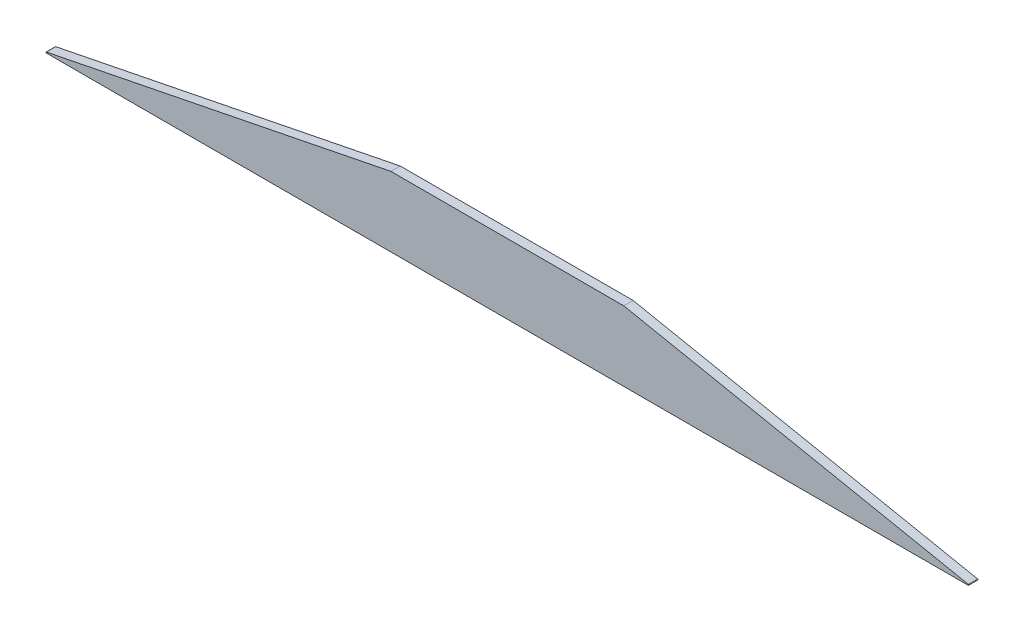
ISO-10303-21;
HEADER;
FILE_DESCRIPTION(('STEP AP214'),'2;1');
FILE_NAME('part.step','',(''),(''),'','','');
FILE_SCHEMA(('AUTOMOTIVE_DESIGN { 1 0 10303 214 1 1 1 1 }'));
ENDSEC;
DATA;
#1=APPLICATION_CONTEXT('core data for automotive mechanical design processes');
#2=APPLICATION_PROTOCOL_DEFINITION('international standard','automotive_design',2000,#1);
#3=PRODUCT_CONTEXT('',#1,'mechanical');
#4=PRODUCT('Part','Part','',(#3));
#5=PRODUCT_RELATED_PRODUCT_CATEGORY('part','',(#4));
#6=PRODUCT_DEFINITION_FORMATION('','',#4);
#7=PRODUCT_DEFINITION_CONTEXT('part definition',#1,'design');
#8=PRODUCT_DEFINITION('design','',#6,#7);
#9=PRODUCT_DEFINITION_SHAPE('','',#8);
#10=(LENGTH_UNIT() NAMED_UNIT(*) SI_UNIT(.MILLI.,.METRE.));
#11=(NAMED_UNIT(*) PLANE_ANGLE_UNIT() SI_UNIT($,.RADIAN.));
#12=(NAMED_UNIT(*) SI_UNIT($,.STERADIAN.) SOLID_ANGLE_UNIT());
#13=UNCERTAINTY_MEASURE_WITH_UNIT(LENGTH_MEASURE(1.E-05),#10,'distance_accuracy_value','');
#14=(GEOMETRIC_REPRESENTATION_CONTEXT(3) GLOBAL_UNCERTAINTY_ASSIGNED_CONTEXT((#13)) GLOBAL_UNIT_ASSIGNED_CONTEXT((#10,
#11,#12)) REPRESENTATION_CONTEXT('',''));
#15=CARTESIAN_POINT('',(0.,0.,0.));
#16=DIRECTION('',(0.,0.,1.));
#17=DIRECTION('',(1.,0.,0.));
#18=AXIS2_PLACEMENT_3D('',#15,#16,#17);
#19=CARTESIAN_POINT('',(-125.,75.,10.));
#20=DIRECTION('',(0.196116135138184,-0.98058067569092,0.));
#21=DIRECTION('',(0.98058067569092,0.196116135138184,0.));
#22=AXIS2_PLACEMENT_3D('',#19,#20,#21);
#23=PLANE('',#22);
#24=DIRECTION('',(-0.98058067569092,-0.196116135138184,0.));
#25=VECTOR('',#24,1.);
#26=CARTESIAN_POINT('',(-125.,75.,0.));
#27=LINE('',#26,#25);
#28=CARTESIAN_POINT('',(-125.,75.,0.));
#29=VERTEX_POINT('',#28);
#30=CARTESIAN_POINT('',(-495.048548310773,0.990290337845479,0.));
#31=VERTEX_POINT('',#30);
#32=EDGE_CURVE('E121',#29,#31,#27,.T.);
#33=ORIENTED_EDGE('',*,*,#32,.T.);
#34=DIRECTION('',(0.,0.,-1.));
#35=VECTOR('',#34,1.);
#36=CARTESIAN_POINT('',(-495.048548310773,0.990290337845479,10.));
#37=LINE('',#36,#35);
#38=CARTESIAN_POINT('',(-495.048548310773,0.990290337845479,10.));
#39=VERTEX_POINT('',#38);
#40=EDGE_CURVE('E11',#31,#39,#37,.F.);
#41=ORIENTED_EDGE('',*,*,#40,.T.);
#42=DIRECTION('',(-0.98058067569092,-0.196116135138184,0.));
#43=VECTOR('',#42,1.);
#44=CARTESIAN_POINT('',(-125.,75.,10.));
#45=LINE('',#44,#43);
#46=CARTESIAN_POINT('',(-125.,75.,10.));
#47=VERTEX_POINT('',#46);
#48=EDGE_CURVE('E127',#47,#39,#45,.T.);
#49=ORIENTED_EDGE('',*,*,#48,.F.);
#50=DIRECTION('',(0.,0.,-1.));
#51=VECTOR('',#50,1.);
#52=CARTESIAN_POINT('',(-125.,75.,10.));
#53=LINE('',#52,#51);
#54=EDGE_CURVE('E113',#47,#29,#53,.T.);
#55=ORIENTED_EDGE('',*,*,#54,.T.);
#56=EDGE_LOOP('',(#33,#41,#49,#55));
#57=FACE_BOUND('',#56,.T.);
#58=ADVANCED_FACE('F39',(#57),#23,.F.);
#59=CARTESIAN_POINT('',(-500.,0.,10.));
#60=DIRECTION('',(0.,1.,0.));
#61=DIRECTION('',(0.,0.,1.));
#62=AXIS2_PLACEMENT_3D('',#59,#60,#61);
#63=PLANE('',#62);
#64=DIRECTION('',(1.,0.,0.));
#65=VECTOR('',#64,1.);
#66=CARTESIAN_POINT('',(-500.,0.,0.));
#67=LINE('',#66,#65);
#68=CARTESIAN_POINT('',(-494.950490243204,0.,0.));
#69=VERTEX_POINT('',#68);
#70=CARTESIAN_POINT('',(494.950490243204,0.,0.));
#71=VERTEX_POINT('',#70);
#72=EDGE_CURVE('E123',#69,#71,#67,.T.);
#73=ORIENTED_EDGE('',*,*,#72,.T.);
#74=DIRECTION('',(0.,0.,-1.));
#75=VECTOR('',#74,1.);
#76=CARTESIAN_POINT('',(494.950490243204,0.,10.));
#77=LINE('',#76,#75);
#78=CARTESIAN_POINT('',(494.950490243204,0.,10.));
#79=VERTEX_POINT('',#78);
#80=EDGE_CURVE('E60',#71,#79,#77,.F.);
#81=ORIENTED_EDGE('',*,*,#80,.T.);
#82=DIRECTION('',(1.,0.,0.));
#83=VECTOR('',#82,1.);
#84=CARTESIAN_POINT('',(-500.,0.,10.));
#85=LINE('',#84,#83);
#86=CARTESIAN_POINT('',(-494.950490243204,0.,10.));
#87=VERTEX_POINT('',#86);
#88=EDGE_CURVE('E103',#87,#79,#85,.T.);
#89=ORIENTED_EDGE('',*,*,#88,.F.);
#90=DIRECTION('',(0.,0.,-1.));
#91=VECTOR('',#90,1.);
#92=CARTESIAN_POINT('',(-494.950490243204,0.,10.));
#93=LINE('',#92,#91);
#94=EDGE_CURVE('E134',#87,#69,#93,.T.);
#95=ORIENTED_EDGE('',*,*,#94,.T.);
#96=EDGE_LOOP('',(#73,#81,#89,#95));
#97=FACE_BOUND('',#96,.T.);
#98=ADVANCED_FACE('F142',(#97),#63,.F.);
#99=CARTESIAN_POINT('',(500.,0.,10.));
#100=DIRECTION('',(-0.196116135138184,-0.98058067569092,0.));
#101=DIRECTION('',(0.98058067569092,-0.196116135138184,0.));
#102=AXIS2_PLACEMENT_3D('',#99,#100,#101);
#103=PLANE('',#102);
#104=DIRECTION('',(-0.98058067569092,0.196116135138184,0.));
#105=VECTOR('',#104,1.);
#106=CARTESIAN_POINT('',(500.,0.,10.));
#107=LINE('',#106,#105);
#108=CARTESIAN_POINT('',(495.048548310773,0.990290337845456,10.));
#109=VERTEX_POINT('',#108);
#110=CARTESIAN_POINT('',(125.,75.,10.));
#111=VERTEX_POINT('',#110);
#112=EDGE_CURVE('E93',#109,#111,#107,.T.);
#113=ORIENTED_EDGE('',*,*,#112,.F.);
#114=DIRECTION('',(0.,0.,-1.));
#115=VECTOR('',#114,1.);
#116=CARTESIAN_POINT('',(495.048548310773,0.990290337845456,10.));
#117=LINE('',#116,#115);
#118=CARTESIAN_POINT('',(495.048548310773,0.990290337845456,0.));
#119=VERTEX_POINT('',#118);
#120=EDGE_CURVE('E112',#109,#119,#117,.T.);
#121=ORIENTED_EDGE('',*,*,#120,.T.);
#122=DIRECTION('',(-0.98058067569092,0.196116135138184,0.));
#123=VECTOR('',#122,1.);
#124=CARTESIAN_POINT('',(500.,0.,0.));
#125=LINE('',#124,#123);
#126=CARTESIAN_POINT('',(125.,75.,0.));
#127=VERTEX_POINT('',#126);
#128=EDGE_CURVE('E109',#119,#127,#125,.T.);
#129=ORIENTED_EDGE('',*,*,#128,.T.);
#130=DIRECTION('',(0.,0.,-1.));
#131=VECTOR('',#130,1.);
#132=CARTESIAN_POINT('',(125.,75.,10.));
#133=LINE('',#132,#131);
#134=EDGE_CURVE('E106',#111,#127,#133,.T.);
#135=ORIENTED_EDGE('',*,*,#134,.F.);
#136=EDGE_LOOP('',(#113,#121,#129,#135));
#137=FACE_BOUND('',#136,.T.);
#138=ADVANCED_FACE('F107',(#137),#103,.F.);
#139=CARTESIAN_POINT('',(125.,75.,10.));
#140=DIRECTION('',(0.,-1.,0.));
#141=DIRECTION('',(0.,0.,-1.));
#142=AXIS2_PLACEMENT_3D('',#139,#140,#141);
#143=PLANE('',#142);
#144=DIRECTION('',(-1.,0.,0.));
#145=VECTOR('',#144,1.);
#146=CARTESIAN_POINT('',(125.,75.,0.));
#147=LINE('',#146,#145);
#148=EDGE_CURVE('E126',#127,#29,#147,.T.);
#149=ORIENTED_EDGE('',*,*,#148,.T.);
#150=ORIENTED_EDGE('',*,*,#54,.F.);
#151=DIRECTION('',(-1.,0.,0.));
#152=VECTOR('',#151,1.);
#153=CARTESIAN_POINT('',(125.,75.,10.));
#154=LINE('',#153,#152);
#155=EDGE_CURVE('E97',#111,#47,#154,.T.);
#156=ORIENTED_EDGE('',*,*,#155,.F.);
#157=ORIENTED_EDGE('',*,*,#134,.T.);
#158=EDGE_LOOP('',(#149,#150,#156,#157));
#159=FACE_BOUND('',#158,.T.);
#160=ADVANCED_FACE('F115',(#159),#143,.F.);
#161=CARTESIAN_POINT('',(0.,0.,10.));
#162=DIRECTION('',(0.,0.,-1.));
#163=DIRECTION('',(-1.,0.,0.));
#164=AXIS2_PLACEMENT_3D('',#161,#162,#163);
#165=PLANE('',#164);
#166=ORIENTED_EDGE('',*,*,#88,.T.);
#167=CARTESIAN_POINT('',(494.950490243204,0.5,10.));
#168=DIRECTION('',(0.,0.,-1.));
#169=DIRECTION('',(-1.,0.,0.));
#170=AXIS2_PLACEMENT_3D('',#167,#168,#169);
#171=CIRCLE('',#170,0.5);
#172=EDGE_CURVE('E47',#79,#109,#171,.F.);
#173=ORIENTED_EDGE('',*,*,#172,.T.);
#174=ORIENTED_EDGE('',*,*,#112,.T.);
#175=ORIENTED_EDGE('',*,*,#155,.T.);
#176=ORIENTED_EDGE('',*,*,#48,.T.);
#177=CARTESIAN_POINT('',(-494.950490243204,0.5,10.));
#178=DIRECTION('',(0.,0.,-1.));
#179=DIRECTION('',(-1.,0.,0.));
#180=AXIS2_PLACEMENT_3D('',#177,#178,#179);
#181=CIRCLE('',#180,0.5);
#182=EDGE_CURVE('E138',#39,#87,#181,.F.);
#183=ORIENTED_EDGE('',*,*,#182,.T.);
#184=EDGE_LOOP('',(#166,#173,#174,#175,#176,#183));
#185=FACE_BOUND('',#184,.T.);
#186=ADVANCED_FACE('F95',(#185),#165,.F.);
#187=CARTESIAN_POINT('',(0.,0.,0.));
#188=DIRECTION('',(0.,0.,-1.));
#189=DIRECTION('',(-1.,0.,0.));
#190=AXIS2_PLACEMENT_3D('',#187,#188,#189);
#191=PLANE('',#190);
#192=ORIENTED_EDGE('',*,*,#128,.F.);
#193=CARTESIAN_POINT('',(494.950490243204,0.5,0.));
#194=DIRECTION('',(0.,0.,-1.));
#195=DIRECTION('',(-1.,0.,0.));
#196=AXIS2_PLACEMENT_3D('',#193,#194,#195);
#197=CIRCLE('',#196,0.5);
#198=EDGE_CURVE('E132',#119,#71,#197,.T.);
#199=ORIENTED_EDGE('',*,*,#198,.T.);
#200=ORIENTED_EDGE('',*,*,#72,.F.);
#201=CARTESIAN_POINT('',(-494.950490243204,0.5,0.));
#202=DIRECTION('',(0.,0.,-1.));
#203=DIRECTION('',(-1.,0.,0.));
#204=AXIS2_PLACEMENT_3D('',#201,#202,#203);
#205=CIRCLE('',#204,0.5);
#206=EDGE_CURVE('E130',#69,#31,#205,.T.);
#207=ORIENTED_EDGE('',*,*,#206,.T.);
#208=ORIENTED_EDGE('',*,*,#32,.F.);
#209=ORIENTED_EDGE('',*,*,#148,.F.);
#210=EDGE_LOOP('',(#192,#199,#200,#207,#208,#209));
#211=FACE_BOUND('',#210,.T.);
#212=ADVANCED_FACE('F146',(#211),#191,.T.);
#213=CARTESIAN_POINT('',(494.950490243204,0.5,10.));
#214=DIRECTION('',(0.,0.,-1.));
#215=DIRECTION('',(-1.,0.,0.));
#216=AXIS2_PLACEMENT_3D('',#213,#214,#215);
#217=CYLINDRICAL_SURFACE('',#216,0.5);
#218=ORIENTED_EDGE('',*,*,#172,.F.);
#219=ORIENTED_EDGE('',*,*,#80,.F.);
#220=ORIENTED_EDGE('',*,*,#198,.F.);
#221=ORIENTED_EDGE('',*,*,#120,.F.);
#222=EDGE_LOOP('',(#218,#219,#220,#221));
#223=FACE_BOUND('',#222,.T.);
#224=ADVANCED_FACE('F156',(#223),#217,.T.);
#225=CARTESIAN_POINT('',(-494.950490243204,0.5,10.));
#226=DIRECTION('',(0.,0.,-1.));
#227=DIRECTION('',(-1.,0.,0.));
#228=AXIS2_PLACEMENT_3D('',#225,#226,#227);
#229=CYLINDRICAL_SURFACE('',#228,0.5);
#230=ORIENTED_EDGE('',*,*,#182,.F.);
#231=ORIENTED_EDGE('',*,*,#40,.F.);
#232=ORIENTED_EDGE('',*,*,#206,.F.);
#233=ORIENTED_EDGE('',*,*,#94,.F.);
#234=EDGE_LOOP('',(#230,#231,#232,#233));
#235=FACE_BOUND('',#234,.T.);
#236=ADVANCED_FACE('F41',(#235),#229,.T.);
#237=CLOSED_SHELL('',(#58,#98,#138,#160,#186,#212,#224,#236));
#238=MANIFOLD_SOLID_BREP('B2',#237);
#239=ADVANCED_BREP_SHAPE_REPRESENTATION('',(#18,#238),#14);
#240=SHAPE_DEFINITION_REPRESENTATION(#9,#239);
ENDSEC;
END-ISO-10303-21;
